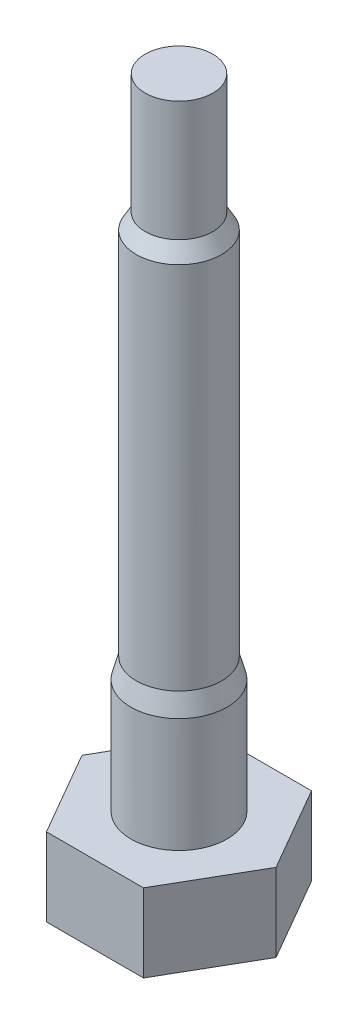
ISO-10303-21;
HEADER;
FILE_DESCRIPTION(('STEP AP214'),'2;1');
FILE_NAME('part.step','',(''),(''),'','','');
FILE_SCHEMA(('AUTOMOTIVE_DESIGN { 1 0 10303 214 1 1 1 1 }'));
ENDSEC;
DATA;
#1=APPLICATION_CONTEXT('core data for automotive mechanical design processes');
#2=APPLICATION_PROTOCOL_DEFINITION('international standard','automotive_design',2000,#1);
#3=PRODUCT_CONTEXT('',#1,'mechanical');
#4=PRODUCT('Part','Part','',(#3));
#5=PRODUCT_RELATED_PRODUCT_CATEGORY('part','',(#4));
#6=PRODUCT_DEFINITION_FORMATION('','',#4);
#7=PRODUCT_DEFINITION_CONTEXT('part definition',#1,'design');
#8=PRODUCT_DEFINITION('design','',#6,#7);
#9=PRODUCT_DEFINITION_SHAPE('','',#8);
#10=(LENGTH_UNIT() NAMED_UNIT(*) SI_UNIT(.MILLI.,.METRE.));
#11=(NAMED_UNIT(*) PLANE_ANGLE_UNIT() SI_UNIT($,.RADIAN.));
#12=(NAMED_UNIT(*) SI_UNIT($,.STERADIAN.) SOLID_ANGLE_UNIT());
#13=UNCERTAINTY_MEASURE_WITH_UNIT(LENGTH_MEASURE(1.E-05),#10,'distance_accuracy_value','');
#14=(GEOMETRIC_REPRESENTATION_CONTEXT(3) GLOBAL_UNCERTAINTY_ASSIGNED_CONTEXT((#13)) GLOBAL_UNIT_ASSIGNED_CONTEXT((#10,
#11,#12)) REPRESENTATION_CONTEXT('',''));
#15=CARTESIAN_POINT('',(0.,0.,0.));
#16=DIRECTION('',(0.,0.,1.));
#17=DIRECTION('',(1.,0.,0.));
#18=AXIS2_PLACEMENT_3D('',#15,#16,#17);
#19=CARTESIAN_POINT('',(3.2042362589755,5.1562,-5.5499));
#20=DIRECTION('',(0.,0.,1.));
#21=DIRECTION('',(1.,0.,0.));
#22=AXIS2_PLACEMENT_3D('',#19,#20,#21);
#23=PLANE('',#22);
#24=DIRECTION('',(-1.,0.,0.));
#25=VECTOR('',#24,1.);
#26=CARTESIAN_POINT('',(3.2042362589755,0.,-5.5499));
#27=LINE('',#26,#25);
#28=CARTESIAN_POINT('',(3.2042362589755,0.,-5.5499));
#29=VERTEX_POINT('',#28);
#30=CARTESIAN_POINT('',(-3.20423625897551,0.,-5.5499));
#31=VERTEX_POINT('',#30);
#32=EDGE_CURVE('E193',#29,#31,#27,.T.);
#33=ORIENTED_EDGE('',*,*,#32,.T.);
#34=DIRECTION('',(0.,-1.,0.));
#35=VECTOR('',#34,1.);
#36=CARTESIAN_POINT('',(-3.20423625897551,5.1562,-5.5499));
#37=LINE('',#36,#35);
#38=CARTESIAN_POINT('',(-3.20423625897551,5.1562,-5.5499));
#39=VERTEX_POINT('',#38);
#40=EDGE_CURVE('E221',#39,#31,#37,.T.);
#41=ORIENTED_EDGE('',*,*,#40,.F.);
#42=DIRECTION('',(-1.,0.,0.));
#43=VECTOR('',#42,1.);
#44=CARTESIAN_POINT('',(3.2042362589755,5.1562,-5.5499));
#45=LINE('',#44,#43);
#46=CARTESIAN_POINT('',(3.2042362589755,5.1562,-5.5499));
#47=VERTEX_POINT('',#46);
#48=EDGE_CURVE('E210',#47,#39,#45,.T.);
#49=ORIENTED_EDGE('',*,*,#48,.F.);
#50=DIRECTION('',(0.,-1.,0.));
#51=VECTOR('',#50,1.);
#52=CARTESIAN_POINT('',(3.2042362589755,5.1562,-5.5499));
#53=LINE('',#52,#51);
#54=EDGE_CURVE('E189',#47,#29,#53,.T.);
#55=ORIENTED_EDGE('',*,*,#54,.T.);
#56=EDGE_LOOP('',(#33,#41,#49,#55));
#57=FACE_BOUND('',#56,.T.);
#58=ADVANCED_FACE('F99',(#57),#23,.F.);
#59=CARTESIAN_POINT('',(-3.20423625897551,5.1562,-5.5499));
#60=DIRECTION('',(0.866025403784438,0.,0.5));
#61=DIRECTION('',(0.5,0.,-0.866025403784439));
#62=AXIS2_PLACEMENT_3D('',#59,#60,#61);
#63=PLANE('',#62);
#64=DIRECTION('',(-0.5,0.,0.866025403784438));
#65=VECTOR('',#64,1.);
#66=CARTESIAN_POINT('',(-3.20423625897551,0.,-5.5499));
#67=LINE('',#66,#65);
#68=CARTESIAN_POINT('',(-6.40847251795101,0.,0.));
#69=VERTEX_POINT('',#68);
#70=EDGE_CURVE('E197',#31,#69,#67,.T.);
#71=ORIENTED_EDGE('',*,*,#70,.T.);
#72=DIRECTION('',(0.,-1.,0.));
#73=VECTOR('',#72,1.);
#74=CARTESIAN_POINT('',(-6.40847251795101,5.1562,0.));
#75=LINE('',#74,#73);
#76=CARTESIAN_POINT('',(-6.40847251795101,5.1562,0.));
#77=VERTEX_POINT('',#76);
#78=EDGE_CURVE('E217',#77,#69,#75,.T.);
#79=ORIENTED_EDGE('',*,*,#78,.F.);
#80=DIRECTION('',(-0.5,0.,0.866025403784438));
#81=VECTOR('',#80,1.);
#82=CARTESIAN_POINT('',(-3.20423625897551,5.1562,-5.5499));
#83=LINE('',#82,#81);
#84=EDGE_CURVE('E157',#39,#77,#83,.T.);
#85=ORIENTED_EDGE('',*,*,#84,.F.);
#86=ORIENTED_EDGE('',*,*,#40,.T.);
#87=EDGE_LOOP('',(#71,#79,#85,#86));
#88=FACE_BOUND('',#87,.T.);
#89=ADVANCED_FACE('F260',(#88),#63,.F.);
#90=CARTESIAN_POINT('',(-6.40847251795101,5.1562,0.));
#91=DIRECTION('',(0.866025403784439,0.,-0.5));
#92=DIRECTION('',(-0.5,0.,-0.866025403784439));
#93=AXIS2_PLACEMENT_3D('',#90,#91,#92);
#94=PLANE('',#93);
#95=DIRECTION('',(0.5,0.,0.866025403784439));
#96=VECTOR('',#95,1.);
#97=CARTESIAN_POINT('',(-6.40847251795101,0.,0.));
#98=LINE('',#97,#96);
#99=CARTESIAN_POINT('',(-3.20423625897551,0.,5.5499));
#100=VERTEX_POINT('',#99);
#101=EDGE_CURVE('E201',#69,#100,#98,.T.);
#102=ORIENTED_EDGE('',*,*,#101,.T.);
#103=DIRECTION('',(0.,-1.,0.));
#104=VECTOR('',#103,1.);
#105=CARTESIAN_POINT('',(-3.20423625897551,5.1562,5.5499));
#106=LINE('',#105,#104);
#107=CARTESIAN_POINT('',(-3.20423625897551,5.1562,5.5499));
#108=VERTEX_POINT('',#107);
#109=EDGE_CURVE('E182',#108,#100,#106,.T.);
#110=ORIENTED_EDGE('',*,*,#109,.F.);
#111=DIRECTION('',(0.5,0.,0.866025403784439));
#112=VECTOR('',#111,1.);
#113=CARTESIAN_POINT('',(-6.40847251795101,5.1562,0.));
#114=LINE('',#113,#112);
#115=EDGE_CURVE('E171',#77,#108,#114,.T.);
#116=ORIENTED_EDGE('',*,*,#115,.F.);
#117=ORIENTED_EDGE('',*,*,#78,.T.);
#118=EDGE_LOOP('',(#102,#110,#116,#117));
#119=FACE_BOUND('',#118,.T.);
#120=ADVANCED_FACE('F257',(#119),#94,.F.);
#121=CARTESIAN_POINT('',(-3.20423625897551,5.1562,5.5499));
#122=DIRECTION('',(0.,0.,-1.));
#123=DIRECTION('',(-1.,0.,0.));
#124=AXIS2_PLACEMENT_3D('',#121,#122,#123);
#125=PLANE('',#124);
#126=DIRECTION('',(1.,0.,0.));
#127=VECTOR('',#126,1.);
#128=CARTESIAN_POINT('',(-3.20423625897551,0.,5.5499));
#129=LINE('',#128,#127);
#130=CARTESIAN_POINT('',(3.2042362589755,0.,5.5499));
#131=VERTEX_POINT('',#130);
#132=EDGE_CURVE('E180',#100,#131,#129,.T.);
#133=ORIENTED_EDGE('',*,*,#132,.T.);
#134=DIRECTION('',(0.,-1.,0.));
#135=VECTOR('',#134,1.);
#136=CARTESIAN_POINT('',(3.2042362589755,5.1562,5.5499));
#137=LINE('',#136,#135);
#138=CARTESIAN_POINT('',(3.2042362589755,5.1562,5.5499));
#139=VERTEX_POINT('',#138);
#140=EDGE_CURVE('E177',#139,#131,#137,.T.);
#141=ORIENTED_EDGE('',*,*,#140,.F.);
#142=DIRECTION('',(1.,0.,0.));
#143=VECTOR('',#142,1.);
#144=CARTESIAN_POINT('',(-3.20423625897551,5.1562,5.5499));
#145=LINE('',#144,#143);
#146=EDGE_CURVE('E165',#108,#139,#145,.T.);
#147=ORIENTED_EDGE('',*,*,#146,.F.);
#148=ORIENTED_EDGE('',*,*,#109,.T.);
#149=EDGE_LOOP('',(#133,#141,#147,#148));
#150=FACE_BOUND('',#149,.T.);
#151=ADVANCED_FACE('F178',(#150),#125,.F.);
#152=CARTESIAN_POINT('',(3.2042362589755,5.1562,5.5499));
#153=DIRECTION('',(-0.866025403784438,0.,-0.5));
#154=DIRECTION('',(-0.5,0.,0.866025403784439));
#155=AXIS2_PLACEMENT_3D('',#152,#153,#154);
#156=PLANE('',#155);
#157=DIRECTION('',(0.5,0.,-0.866025403784438));
#158=VECTOR('',#157,1.);
#159=CARTESIAN_POINT('',(3.2042362589755,0.,5.5499));
#160=LINE('',#159,#158);
#161=CARTESIAN_POINT('',(6.40847251795101,0.,0.));
#162=VERTEX_POINT('',#161);
#163=EDGE_CURVE('E142',#131,#162,#160,.T.);
#164=ORIENTED_EDGE('',*,*,#163,.T.);
#165=DIRECTION('',(0.,-1.,0.));
#166=VECTOR('',#165,1.);
#167=CARTESIAN_POINT('',(6.40847251795101,5.1562,0.));
#168=LINE('',#167,#166);
#169=CARTESIAN_POINT('',(6.40847251795101,5.1562,0.));
#170=VERTEX_POINT('',#169);
#171=EDGE_CURVE('E183',#170,#162,#168,.T.);
#172=ORIENTED_EDGE('',*,*,#171,.F.);
#173=DIRECTION('',(0.5,0.,-0.866025403784438));
#174=VECTOR('',#173,1.);
#175=CARTESIAN_POINT('',(3.2042362589755,5.1562,5.5499));
#176=LINE('',#175,#174);
#177=EDGE_CURVE('E169',#139,#170,#176,.T.);
#178=ORIENTED_EDGE('',*,*,#177,.F.);
#179=ORIENTED_EDGE('',*,*,#140,.T.);
#180=EDGE_LOOP('',(#164,#172,#178,#179));
#181=FACE_BOUND('',#180,.T.);
#182=ADVANCED_FACE('F185',(#181),#156,.F.);
#183=CARTESIAN_POINT('',(6.40847251795101,5.1562,0.));
#184=DIRECTION('',(-0.866025403784439,0.,0.5));
#185=DIRECTION('',(0.5,0.,0.866025403784439));
#186=AXIS2_PLACEMENT_3D('',#183,#184,#185);
#187=PLANE('',#186);
#188=DIRECTION('',(-0.5,0.,-0.866025403784439));
#189=VECTOR('',#188,1.);
#190=CARTESIAN_POINT('',(6.40847251795101,0.,0.));
#191=LINE('',#190,#189);
#192=EDGE_CURVE('E148',#162,#29,#191,.T.);
#193=ORIENTED_EDGE('',*,*,#192,.T.);
#194=ORIENTED_EDGE('',*,*,#54,.F.);
#195=DIRECTION('',(-0.5,0.,-0.866025403784439));
#196=VECTOR('',#195,1.);
#197=CARTESIAN_POINT('',(6.40847251795101,5.1562,0.));
#198=LINE('',#197,#196);
#199=EDGE_CURVE('E118',#170,#47,#198,.T.);
#200=ORIENTED_EDGE('',*,*,#199,.F.);
#201=ORIENTED_EDGE('',*,*,#171,.T.);
#202=EDGE_LOOP('',(#193,#194,#200,#201));
#203=FACE_BOUND('',#202,.T.);
#204=ADVANCED_FACE('F246',(#203),#187,.F.);
#205=CARTESIAN_POINT('',(0.,5.1562,0.));
#206=DIRECTION('',(0.,1.,0.));
#207=DIRECTION('',(0.,0.,1.));
#208=AXIS2_PLACEMENT_3D('',#205,#206,#207);
#209=PLANE('',#208);
#210=CARTESIAN_POINT('',(0.,5.1562,0.));
#211=DIRECTION('',(0.,1.,0.));
#212=DIRECTION('',(0.,0.,1.));
#213=AXIS2_PLACEMENT_3D('',#210,#211,#212);
#214=CIRCLE('',#213,3.175);
#215=CARTESIAN_POINT('',(0.,5.1562,3.175));
#216=VERTEX_POINT('',#215);
#217=EDGE_CURVE('E224',#216,#216,#214,.T.);
#218=ORIENTED_EDGE('',*,*,#217,.F.);
#219=EDGE_LOOP('',(#218));
#220=FACE_BOUND('',#219,.T.);
#221=ORIENTED_EDGE('',*,*,#48,.T.);
#222=ORIENTED_EDGE('',*,*,#84,.T.);
#223=ORIENTED_EDGE('',*,*,#115,.T.);
#224=ORIENTED_EDGE('',*,*,#146,.T.);
#225=ORIENTED_EDGE('',*,*,#177,.T.);
#226=ORIENTED_EDGE('',*,*,#199,.T.);
#227=EDGE_LOOP('',(#221,#222,#223,#224,#225,#226));
#228=FACE_BOUND('',#227,.T.);
#229=ADVANCED_FACE('F167',(#220,#228),#209,.T.);
#230=CARTESIAN_POINT('',(0.,0.,0.));
#231=DIRECTION('',(0.,1.,0.));
#232=DIRECTION('',(0.,0.,1.));
#233=AXIS2_PLACEMENT_3D('',#230,#231,#232);
#234=PLANE('',#233);
#235=CARTESIAN_POINT('',(0.,0.,0.));
#236=DIRECTION('',(0.,-1.,0.));
#237=DIRECTION('',(0.,0.,-1.));
#238=AXIS2_PLACEMENT_3D('',#235,#236,#237);
#239=CIRCLE('',#238,3.175);
#240=CARTESIAN_POINT('',(0.,0.,-3.175));
#241=VERTEX_POINT('',#240);
#242=EDGE_CURVE('E347',#241,#241,#239,.T.);
#243=ORIENTED_EDGE('',*,*,#242,.F.);
#244=EDGE_LOOP('',(#243));
#245=FACE_BOUND('',#244,.T.);
#246=ORIENTED_EDGE('',*,*,#32,.F.);
#247=ORIENTED_EDGE('',*,*,#192,.F.);
#248=ORIENTED_EDGE('',*,*,#163,.F.);
#249=ORIENTED_EDGE('',*,*,#132,.F.);
#250=ORIENTED_EDGE('',*,*,#101,.F.);
#251=ORIENTED_EDGE('',*,*,#70,.F.);
#252=EDGE_LOOP('',(#246,#247,#248,#249,#250,#251));
#253=FACE_BOUND('',#252,.T.);
#254=ADVANCED_FACE('F242',(#245,#253),#234,.F.);
#255=CARTESIAN_POINT('',(0.,12.7,0.));
#256=DIRECTION('',(0.,-1.,0.));
#257=DIRECTION('',(0.,0.,-1.));
#258=AXIS2_PLACEMENT_3D('',#255,#256,#257);
#259=CYLINDRICAL_SURFACE('',#258,3.175);
#260=CARTESIAN_POINT('',(3.175,12.7,0.));
#261=CARTESIAN_POINT('',(3.17500066804615,12.6999987956631,0.0892114796995734));
#262=CARTESIAN_POINT('',(3.17123852700166,12.6998402297505,0.178412327936924));
#263=CARTESIAN_POINT('',(3.15621847252985,12.6995617630556,0.356179029617902));
#264=CARTESIAN_POINT('',(3.14496123124316,12.6994418588077,0.44474493928134));
#265=CARTESIAN_POINT('',(3.11501301175547,12.699403615837,0.620723265292362));
#266=CARTESIAN_POINT('',(3.09631252472967,12.6994855356441,0.708134057809241));
#267=CARTESIAN_POINT('',(3.05160739606798,12.6998007378407,0.881073495619962));
#268=CARTESIAN_POINT('',(3.02560323264688,12.7000340103217,0.966602263745808));
#269=CARTESIAN_POINT('',(2.98127501149104,12.700308948663,1.09298612397601));
#270=CARTESIAN_POINT('',(2.96561349890542,12.7003880961716,1.13479239008732));
#271=CARTESIAN_POINT('',(2.93254265917055,12.7004562555244,1.21770711787269));
#272=CARTESIAN_POINT('',(2.9151333612047,12.7004452688735,1.25881559118466));
#273=CARTESIAN_POINT('',(2.86032778148626,12.7003208220235,1.38098295230681));
#274=CARTESIAN_POINT('',(2.82034795175892,12.7001159067612,1.46090048836334));
#275=CARTESIAN_POINT('',(2.73381264852016,12.6998049651829,1.61705338160941));
#276=CARTESIAN_POINT('',(2.68725885344378,12.699698913678,1.69328967203133));
#277=CARTESIAN_POINT('',(2.58789644821255,12.6996862712116,1.84157051521897));
#278=CARTESIAN_POINT('',(2.53508786353219,12.6997796794378,1.91361508505493));
#279=CARTESIAN_POINT('',(2.42357901753758,12.7000714716982,2.05301103324262));
#280=CARTESIAN_POINT('',(2.36487843388698,12.7002698614781,2.12036215448577));
#281=CARTESIAN_POINT('',(2.27274600711182,12.7003906485019,2.21748597694256));
#282=CARTESIAN_POINT('',(2.24135131261152,12.7004014361458,2.24921333772721));
#283=CARTESIAN_POINT('',(2.17725256977265,12.7003424908888,2.31131730361052));
#284=CARTESIAN_POINT('',(2.14454850551439,12.7002727570087,2.34169389227662));
#285=CARTESIAN_POINT('',(2.04455836195408,12.7000377693808,2.43071332651415));
#286=CARTESIAN_POINT('',(1.97538264740241,12.6998467129905,2.48725815489638));
#287=CARTESIAN_POINT('',(1.83252261868998,12.6996276053121,2.59431222092848));
#288=CARTESIAN_POINT('',(1.75883830881364,12.699599553869,2.64482146431372));
#289=CARTESIAN_POINT('',(1.60749023500245,12.6997375098977,2.73944562934866));
#290=CARTESIAN_POINT('',(1.52982729130956,12.6999034775227,2.78356186186918));
#291=CARTESIAN_POINT('',(1.37102642004151,12.7002410067086,2.86511477494592));
#292=CARTESIAN_POINT('',(1.28988693796305,12.7004125707634,2.90254842796812));
#293=CARTESIAN_POINT('',(1.12474264504461,12.7003998366292,2.97044603626087));
#294=CARTESIAN_POINT('',(1.04073783913484,12.7002155390524,3.00091000352307));
#295=CARTESIAN_POINT('',(0.870497897151222,12.6998784801836,3.05463934912132));
#296=CARTESIAN_POINT('',(0.784263785914742,12.6997257046806,3.07790797364498));
#297=CARTESIAN_POINT('',(0.61012256412016,12.6996164347249,3.1171050778318));
#298=CARTESIAN_POINT('',(0.52221502571364,12.6996599911585,3.13303165336342));
#299=CARTESIAN_POINT('',(0.345359317470969,12.6999003780277,3.15742260360753));
#300=CARTESIAN_POINT('',(0.256411146868026,12.7000972085763,3.16588697282115));
#301=CARTESIAN_POINT('',(0.122713654247171,12.700320648543,3.17294189823177));
#302=CARTESIAN_POINT('',(0.078096883373178,12.7003831639005,3.17435310889001));
#303=CARTESIAN_POINT('',(-0.0111560236969769,12.7004204116712,3.17529404046456));
#304=CARTESIAN_POINT('',(-0.0557921596543766,12.7003951451376,3.17482378395428));
#305=CARTESIAN_POINT('',(-0.189608037780999,12.7002406218208,3.17058920259825));
#306=CARTESIAN_POINT('',(-0.278714565411064,12.7000326644206,3.16400208279061));
#307=CARTESIAN_POINT('',(-0.456042980689964,12.6997315995904,3.14334532704295));
#308=CARTESIAN_POINT('',(-0.544264891788434,12.699638489108,3.12927588998315));
#309=CARTESIAN_POINT('',(-0.719210184345248,12.699655567766,3.09375638793322));
#310=CARTESIAN_POINT('',(-0.805933565677795,12.6997657569236,3.07230632232352));
#311=CARTESIAN_POINT('',(-0.977274822520131,12.7000831301495,3.02217214956026));
#312=CARTESIAN_POINT('',(-1.06189269534916,12.7002903143414,2.99348803319671));
#313=CARTESIAN_POINT('',(-1.18676131149117,12.7004075310723,2.94520225145276));
#314=CARTESIAN_POINT('',(-1.22804543864869,12.7004143338025,2.92822830166503));
#315=CARTESIAN_POINT('',(-1.30986238745832,12.7003490513639,2.89255548285971));
#316=CARTESIAN_POINT('',(-1.35039519558065,12.700276964776,2.87385658281534));
#317=CARTESIAN_POINT('',(-1.47074941762506,12.7000369331207,2.81522328321624));
#318=CARTESIAN_POINT('',(-1.54934897935035,12.6998451903213,2.77274363845178));
#319=CARTESIAN_POINT('',(-1.70268022773141,12.6996264594089,2.68131962083326));
#320=CARTESIAN_POINT('',(-1.77741191754741,12.6995994711611,2.6323752532613));
#321=CARTESIAN_POINT('',(-1.92248939008046,12.6997395138185,2.52836406526786));
#322=CARTESIAN_POINT('',(-1.99283517118801,12.6999065447948,2.47329724259964));
#323=CARTESIAN_POINT('',(-2.12863738230503,12.7002371340459,2.35743396404006));
#324=CARTESIAN_POINT('',(-2.19409381824127,12.700400692325,2.29663751509423));
#325=CARTESIAN_POINT('',(-2.31965507463998,12.7003816872097,2.16974479411574));
#326=CARTESIAN_POINT('',(-2.37975970642491,12.7001991116175,2.10364833538756));
#327=CARTESIAN_POINT('',(-2.49418769200483,12.6998802407988,1.96662644125098));
#328=CARTESIAN_POINT('',(-2.54851104428616,12.6997439455845,1.89570100457826));
#329=CARTESIAN_POINT('',(-2.65098888540422,12.6996662828093,1.74952882098145));
#330=CARTESIAN_POINT('',(-2.69914337368839,12.699724915266,1.67428207367029));
#331=CARTESIAN_POINT('',(-2.78894670219131,12.6999822864131,1.51998894160511));
#332=CARTESIAN_POINT('',(-2.83059553960176,12.700181025164,1.44094255521093));
#333=CARTESIAN_POINT('',(-2.8879561327685,12.7003862979077,1.31997281639428));
#334=CARTESIAN_POINT('',(-2.90622610052374,12.7004392503713,1.27924452536006));
#335=CARTESIAN_POINT('',(-2.94103346077828,12.7004502682379,1.19705424957848));
#336=CARTESIAN_POINT('',(-2.95757085577841,12.7004083337779,1.15559226589026));
#337=CARTESIAN_POINT('',(-3.00453601378475,12.7002029939981,1.0302185086585));
#338=CARTESIAN_POINT('',(-3.03232522085151,12.6999600688965,0.945301058491968));
#339=CARTESIAN_POINT('',(-3.08064759187292,12.6995862842079,0.773437837003221));
#340=CARTESIAN_POINT('',(-3.10118076138941,12.6994554245351,0.686492067235789));
#341=CARTESIAN_POINT('',(-3.13485075998447,12.6993966763062,0.511176862156631));
#342=CARTESIAN_POINT('',(-3.14798759065112,12.6994687877066,0.422807427150586));
#343=CARTESIAN_POINT('',(-3.16676940650138,12.6997315421912,0.245282437228455));
#344=CARTESIAN_POINT('',(-3.17241485247487,12.699922177984,0.156126931002669));
#345=CARTESIAN_POINT('',(-3.17617569190627,12.7000220441576,-0.0223431509904027));
#346=CARTESIAN_POINT('',(-3.17429108666699,12.6999312745869,-0.111657726730164));
#347=CARTESIAN_POINT('',(-3.16300512629471,12.6996798721559,-0.289810465261936));
#348=CARTESIAN_POINT('',(-3.15360376861942,12.6995192392719,-0.378648627892805));
#349=CARTESIAN_POINT('',(-3.12735110202942,12.6993877955324,-0.555217482892212));
#350=CARTESIAN_POINT('',(-3.11049979877964,12.6994169845326,-0.642948176102815));
#351=CARTESIAN_POINT('',(-3.06946620645862,12.6996605667185,-0.816681973669178));
#352=CARTESIAN_POINT('',(-3.04528357373062,12.6998749685868,-0.902684996838699));
#353=CARTESIAN_POINT('',(-2.98975934524163,12.7002695047297,-1.07234841203395));
#354=CARTESIAN_POINT('',(-2.9584177566607,12.7004496390385,-1.15600880640913));
#355=CARTESIAN_POINT('',(-2.88879865737803,12.7004398599594,-1.32039184925953));
#356=CARTESIAN_POINT('',(-2.85052114557494,12.7002499465126,-1.40111449726828));
#357=CARTESIAN_POINT('',(-2.767301563389,12.6999127505427,-1.55904901352777));
#358=CARTESIAN_POINT('',(-2.72235948825634,12.69976546805,-1.63626087927634));
#359=CARTESIAN_POINT('',(-2.62613207981478,12.6996634851959,-1.78662356900934));
#360=CARTESIAN_POINT('',(-2.57484663492103,12.6997087882227,-1.85977432152281));
#361=CARTESIAN_POINT('',(-2.4662875579303,12.6999442881239,-2.0015034526942));
#362=CARTESIAN_POINT('',(-2.40901392254421,12.700134485078,-2.07008182884066));
#363=CARTESIAN_POINT('',(-2.31893991267812,12.700332841732,-2.16913267281095));
#364=CARTESIAN_POINT('',(-2.28821766277958,12.7003844717273,-2.20151689506254));
#365=CARTESIAN_POINT('',(-2.22543574252222,12.7003979334104,-2.26496191232114));
#366=CARTESIAN_POINT('',(-2.19337607241292,12.7003597651149,-2.29602270757507));
#367=CARTESIAN_POINT('',(-2.09527696897043,12.700180315773,-2.38713244262961));
#368=CARTESIAN_POINT('',(-2.02730407376672,12.6999741021609,-2.44512342926776));
#369=CARTESIAN_POINT('',(-1.88672396622237,12.6996898870444,-2.55516501262463));
#370=CARTESIAN_POINT('',(-1.81411680375507,12.6996118841604,-2.60721567325554));
#371=CARTESIAN_POINT('',(-1.66477352376217,12.6996559261225,-2.70501757549271));
#372=CARTESIAN_POINT('',(-1.58803740520034,12.6997779710188,-2.75076881551805));
#373=CARTESIAN_POINT('',(-1.43098465257938,12.7001149381488,-2.83564379139157));
#374=CARTESIAN_POINT('',(-1.35066802151867,12.7003298603048,-2.87476753278967));
#375=CARTESIAN_POINT('',(-1.18702410699898,12.7004337130804,-2.94611029283593));
#376=CARTESIAN_POINT('',(-1.10369682489137,12.7003226438465,-2.9783293145833));
#377=CARTESIAN_POINT('',(-0.934628258706036,12.7000201172787,-3.0356320133256));
#378=CARTESIAN_POINT('',(-0.848887078035371,12.6998286633835,-3.06071599546313));
#379=CARTESIAN_POINT('',(-0.675596204290306,12.6996281784152,-3.10357234317822));
#380=CARTESIAN_POINT('',(-0.588046512623295,12.6996191472002,-3.12134471444546));
#381=CARTESIAN_POINT('',(-0.411761344808559,12.6997882435463,-3.14945142705188));
#382=CARTESIAN_POINT('',(-0.323025866100786,12.6999663715115,-3.15978575233008));
#383=CARTESIAN_POINT('',(-0.144999555679939,12.7002877968917,-3.17294290162053));
#384=CARTESIAN_POINT('',(-0.0557087242877251,12.7004310943269,-3.17576572997222));
#385=CARTESIAN_POINT('',(0.122795461960807,12.700372411586,-3.17387987979561));
#386=CARTESIAN_POINT('',(0.212008814631801,12.7001704219684,-3.16917099531956));
#387=CARTESIAN_POINT('',(0.389722573344511,12.6998318565978,-3.1522544243721));
#388=CARTESIAN_POINT('',(0.478222979263582,12.6996952808561,-3.14004673661073));
#389=CARTESIAN_POINT('',(0.653878312572644,12.6996209306763,-3.10822075646505));
#390=CARTESIAN_POINT('',(0.741033237316302,12.6996831566293,-3.08860244950724));
#391=CARTESIAN_POINT('',(0.913391164955352,12.6999474516496,-3.0420891833483));
#392=CARTESIAN_POINT('',(0.998594166678588,12.7001495208009,-3.01519421977757));
#393=CARTESIAN_POINT('',(1.12445344780675,12.7003515466,-2.96954935447788));
#394=CARTESIAN_POINT('',(1.16608761541816,12.7004020422026,-2.95344822863927));
#395=CARTESIAN_POINT('',(1.24864044420654,12.7004103775218,-2.91950574683688));
#396=CARTESIAN_POINT('',(1.28955910544703,12.7003682172465,-2.9016643910276));
#397=CARTESIAN_POINT('',(1.41112820059234,12.7001802463516,-2.84557626877307));
#398=CARTESIAN_POINT('',(1.49061040195797,12.6999729542396,-2.80475867905565));
#399=CARTESIAN_POINT('',(1.64584041657692,12.6996884754526,-2.71657958831338));
#400=CARTESIAN_POINT('',(1.72158837685078,12.6996112836514,-2.66921834519786));
#401=CARTESIAN_POINT('',(1.86882806736398,12.6996572009181,-2.56828198961017));
#402=CARTESIAN_POINT('',(1.94031980097683,12.6997803098271,-2.51470688206322));
#403=CARTESIAN_POINT('',(2.07852474483769,12.700113996874,-2.40173375284949));
#404=CARTESIAN_POINT('',(2.1452386784925,12.7003245617371,-2.34233661593586));
#405=CARTESIAN_POINT('',(2.2734272749259,12.7004194282541,-2.21813388524052));
#406=CARTESIAN_POINT('',(2.33490191935161,12.700303728765,-2.15332827251483));
#407=CARTESIAN_POINT('',(2.45218916282303,12.7000118005129,-2.01875261974013));
#408=CARTESIAN_POINT('',(2.50800031786194,12.6998355563629,-1.94898132127812));
#409=CARTESIAN_POINT('',(2.61354544929997,12.6996662452248,-1.80498577432477));
#410=CARTESIAN_POINT('',(2.66327952444066,12.69967317526,-1.73076159821388));
#411=CARTESIAN_POINT('',(2.75633966835455,12.6998659577136,-1.57835124465533));
#412=CARTESIAN_POINT('',(2.79966268955624,12.700051894912,-1.50016320649682));
#413=CARTESIAN_POINT('',(2.87956709444057,12.7003590968849,-1.34040875362401));
#414=CARTESIAN_POINT('',(2.91614803885662,12.7004803574464,-1.25884211920772));
#415=CARTESIAN_POINT('',(2.98226783516299,12.7003633912027,-1.09300613023484));
#416=CARTESIAN_POINT('',(3.01181442011465,12.7001255612876,-1.00873986021151));
#417=CARTESIAN_POINT('',(3.06370032830251,12.6997127274992,-0.838046684381591));
#418=CARTESIAN_POINT('',(3.08604153298594,12.6995377072238,-0.751620348966125));
#419=CARTESIAN_POINT('',(3.12804771295575,12.6993741480141,-0.555319666313466));
#420=CARTESIAN_POINT('',(3.1456398661206,12.6994433153123,-0.444995597013636));
#421=CARTESIAN_POINT('',(3.16911559227657,12.6997569942259,-0.223108811475924));
#422=CARTESIAN_POINT('',(3.17499916470459,12.7000015058496,-0.111546095178472));
#423=CARTESIAN_POINT('',(3.175,12.7,0.));
#424=B_SPLINE_CURVE_WITH_KNOTS('',3,(#260,#261,#262,#263,#264,#265,#266,#267,#268,#269,#270,
#271,#272,#273,#274,#275,#276,#277,#278,#279,#280,#281,#282,#283,#284,#285,#286,#287,#288,#289,
#290,#291,#292,#293,#294,#295,#296,#297,#298,#299,#300,#301,#302,#303,#304,#305,#306,#307,#308,
#309,#310,#311,#312,#313,#314,#315,#316,#317,#318,#319,#320,#321,#322,#323,#324,#325,#326,#327,
#328,#329,#330,#331,#332,#333,#334,#335,#336,#337,#338,#339,#340,#341,#342,#343,#344,#345,#346,
#347,#348,#349,#350,#351,#352,#353,#354,#355,#356,#357,#358,#359,#360,#361,#362,#363,#364,#365,
#366,#367,#368,#369,#370,#371,#372,#373,#374,#375,#376,#377,#378,#379,#380,#381,#382,#383,#384,
#385,#386,#387,#388,#389,#390,#391,#392,#393,#394,#395,#396,#397,#398,#399,#400,#401,#402,#403,
#404,#405,#406,#407,#408,#409,#410,#411,#412,#413,#414,#415,#416,#417,#418,#419,#420,#421,#422,
#423),.UNSPECIFIED.,.T.,.F.,(4,2,2,2,2,2,2,2,2,2,2,2,2,2,2,2,2,2,2,2,2,2,2,2,2,2,2,2,2,2,2,2,2,
2,2,2,2,2,2,2,2,2,2,2,2,2,2,2,2,2,2,2,2,2,2,2,2,2,2,2,2,2,2,2,2,2,2,2,2,2,2,2,2,2,2,2,2,2,2,2,2,
4),(0.,0.267537388039238,0.535050787268836,0.802907040253556,1.07074575919537,1.20464236108109,
1.33853672761823,1.60627251473767,1.87394006794776,2.14160653104036,2.40928764547795,
2.54315724899264,2.67702848062607,2.94472018033721,3.21241162567071,3.48004810364286,
3.7478055279478,4.01556249156063,4.2831984794582,4.55090383870272,4.81860939521878,
4.95249249409004,5.08637398666735,5.35407913276135,5.62177716359993,5.88947521691077,
6.15717361104139,6.29105132829479,6.42493145408508,6.69262004442505,6.96030841604741,
7.22799688590281,7.49568503126606,7.76338261022536,8.03108025927346,8.29877793229955,
8.56647572088224,8.70035666582875,8.83423741752482,9.10193978214422,9.36964194156644,
9.63734404350997,9.90502967851918,10.1727152672149,10.4404009464464,10.7080864221305,
10.9757844475369,11.2434822044575,11.511180003886,11.7788779941026,12.0465806940066,
12.314283540951,12.4481647911012,12.5820460162738,12.8497490540169,13.1174492112621,
13.3851494356903,13.6528494359433,13.9205493160376,14.1882377457504,14.4559259671551,
14.7236147665772,14.9913034113533,15.2589993759538,15.526695386604,15.7943919236996,
16.0620886215466,16.1959717288892,16.3298548243438,16.5975616690526,16.8652579654629,
17.1329540496931,17.4006095159836,17.6682659198154,17.9359903968133,18.2037105231938,
18.4715575075422,18.7394219367635,19.0069905214211,19.2744891827017,19.6090061037898,
19.9435230409656),.UNSPECIFIED.);
#425=CARTESIAN_POINT('',(-3.175,12.7,0.));
#426=VERTEX_POINT('',#425);
#427=EDGE_CURVE('E198',#426,#426,#424,.F.);
#428=ORIENTED_EDGE('',*,*,#427,.F.);
#429=EDGE_LOOP('',(#428));
#430=FACE_BOUND('',#429,.T.);
#431=ORIENTED_EDGE('',*,*,#217,.T.);
#432=EDGE_LOOP('',(#431));
#433=FACE_BOUND('',#432,.T.);
#434=ADVANCED_FACE('F238',(#430,#433),#259,.T.);
#435=CARTESIAN_POINT('',(-3.178556,12.6867288273283,0.));
#436=CARTESIAN_POINT('',(-3.17737066666667,12.6911525515522,0.));
#437=CARTESIAN_POINT('',(-3.17618533333333,12.6955762757761,0.));
#438=CARTESIAN_POINT('',(-3.175,12.7,0.));
#439=CARTESIAN_POINT('',(-3.05646666666667,13.1423724223905,0.));
#440=CARTESIAN_POINT('',(-2.93793333333334,13.584744844781,0.));
#441=CARTESIAN_POINT('',(-2.8194,14.0271172671715,0.));
#442=CARTESIAN_POINT('',(-3.178556,12.6867288273283,0.416072004122435));
#443=CARTESIAN_POINT('',(-3.17737066666667,12.6911525515522,0.415916844353171));
#444=CARTESIAN_POINT('',(-3.17618533333333,12.6955762757761,0.415761684583907));
#445=CARTESIAN_POINT('',(-3.175,12.7,0.415606524814643));
#446=CARTESIAN_POINT('',(-3.05646666666667,13.1423724223905,0.40009054788823));
#447=CARTESIAN_POINT('',(-2.93793333333334,13.584744844781,0.384574570961817));
#448=CARTESIAN_POINT('',(-2.8194,14.0271172671715,0.369058594035403));
#449=CARTESIAN_POINT('',(-3.01321963154757,12.6867288273283,1.24810575079722));
#450=CARTESIAN_POINT('',(-3.01209604790897,12.6911525515522,1.247640313375));
#451=CARTESIAN_POINT('',(-3.01097246427038,12.6955762757761,1.24717487595278));
#452=CARTESIAN_POINT('',(-3.00984888063178,12.7,1.24670943853056));
#453=CARTESIAN_POINT('',(-2.8974905167722,13.1423724223905,1.20016569630867));
#454=CARTESIAN_POINT('',(-2.78513215291263,13.584744844781,1.15362195408678));
#455=CARTESIAN_POINT('',(-2.67277378905305,14.0271172671715,1.10707821186489));
#456=CARTESIAN_POINT('',(-2.3061328329366,12.6867288273283,2.30618003036527));
#457=CARTESIAN_POINT('',(-2.30527277942789,12.6911525515522,2.30532005673191));
#458=CARTESIAN_POINT('',(-2.30441272591919,12.6955762757761,2.30446008309855));
#459=CARTESIAN_POINT('',(-2.30355267241048,12.7,2.30360010946518));
#460=CARTESIAN_POINT('',(-2.21754732153994,13.1423724223905,2.21760274612891));
#461=CARTESIAN_POINT('',(-2.1315419706694,13.584744844781,2.13160538279264));
#462=CARTESIAN_POINT('',(-2.04553661979887,14.0271172671715,2.04560801945637));
#463=CARTESIAN_POINT('',(-1.24810576015478,12.6867288273283,3.01315256380509));
#464=CARTESIAN_POINT('',(-1.24764032389349,12.6911525515522,3.01202890357291));
#465=CARTESIAN_POINT('',(-1.24717488763219,12.6955762757761,3.01090524334074));
#466=CARTESIAN_POINT('',(-1.2467094513709,12.7,3.00978158310857));
#467=CARTESIAN_POINT('',(-1.20016582524169,13.1423724223905,2.89741555989141));
#468=CARTESIAN_POINT('',(-1.15362219911247,13.584744844781,2.78504953667426));
#469=CARTESIAN_POINT('',(-1.10707857298326,14.0271172671715,2.6726835134571));
#470=CARTESIAN_POINT('',(0.,12.6867288273283,3.26142269737321));
#471=CARTESIAN_POINT('',(0.,12.6911525515522,3.26020646997926));
#472=CARTESIAN_POINT('',(0.,12.6955762757761,3.25899024258532));
#473=CARTESIAN_POINT('',(0.,12.7,3.25777401519137));
#474=CARTESIAN_POINT('',(0.,13.1423724223905,3.13615127579686));
#475=CARTESIAN_POINT('',(0.,13.584744844781,3.01452853640235));
#476=CARTESIAN_POINT('',(0.,14.0271172671715,2.89290579700783));
#477=CARTESIAN_POINT('',(1.24810576015479,12.6867288273283,3.01315256380509));
#478=CARTESIAN_POINT('',(1.2476403238935,12.6911525515522,3.01202890357291));
#479=CARTESIAN_POINT('',(1.2471748876322,12.6955762757761,3.01090524334074));
#480=CARTESIAN_POINT('',(1.24670945137091,12.7,3.00978158310857));
#481=CARTESIAN_POINT('',(1.20016582524169,13.1423724223905,2.89741555989141));
#482=CARTESIAN_POINT('',(1.15362219911247,13.584744844781,2.78504953667425));
#483=CARTESIAN_POINT('',(1.10707857298325,14.0271172671715,2.67268351345709));
#484=CARTESIAN_POINT('',(2.30613283293659,12.6867288273283,2.30618003036527));
#485=CARTESIAN_POINT('',(2.30527277942788,12.6911525515522,2.3053200567319));
#486=CARTESIAN_POINT('',(2.30441272591918,12.6955762757761,2.30446008309854));
#487=CARTESIAN_POINT('',(2.30355267241047,12.7,2.30360010946518));
#488=CARTESIAN_POINT('',(2.21754732153994,13.1423724223905,2.21760274612891));
#489=CARTESIAN_POINT('',(2.13154197066941,13.584744844781,2.13160538279264));
#490=CARTESIAN_POINT('',(2.04553661979887,14.0271172671715,2.04560801945637));
#491=CARTESIAN_POINT('',(3.01321963154758,12.6867288273283,1.24810575079722));
#492=CARTESIAN_POINT('',(3.01209604790899,12.6911525515522,1.247640313375));
#493=CARTESIAN_POINT('',(3.01097246427039,12.6955762757761,1.24717487595278));
#494=CARTESIAN_POINT('',(3.0098488806318,12.7,1.24670943853056));
#495=CARTESIAN_POINT('',(2.89749051677221,13.1423724223905,1.20016569630867));
#496=CARTESIAN_POINT('',(2.78513215291263,13.584744844781,1.15362195408677));
#497=CARTESIAN_POINT('',(2.67277378905305,14.0271172671715,1.10707821186488));
#498=CARTESIAN_POINT('',(3.178556,12.6867288273283,0.416072004122436));
#499=CARTESIAN_POINT('',(3.17737066666667,12.6911525515522,0.415916844353172));
#500=CARTESIAN_POINT('',(3.17618533333333,12.6955762757761,0.415761684583908));
#501=CARTESIAN_POINT('',(3.175,12.7,0.415606524814644));
#502=CARTESIAN_POINT('',(3.05646666666667,13.1423724223905,0.400090547888231));
#503=CARTESIAN_POINT('',(2.93793333333334,13.584744844781,0.384574570961817));
#504=CARTESIAN_POINT('',(2.8194,14.0271172671715,0.369058594035404));
#505=CARTESIAN_POINT('',(3.178556,12.6867288273283,-0.416072004122436));
#506=CARTESIAN_POINT('',(3.17737066666667,12.6911525515522,-0.415916844353172));
#507=CARTESIAN_POINT('',(3.17618533333333,12.6955762757761,-0.415761684583907));
#508=CARTESIAN_POINT('',(3.175,12.7,-0.415606524814643));
#509=CARTESIAN_POINT('',(3.05646666666667,13.1423724223905,-0.40009054788823));
#510=CARTESIAN_POINT('',(2.93793333333334,13.584744844781,-0.384574570961817));
#511=CARTESIAN_POINT('',(2.8194,14.0271172671715,-0.369058594035404));
#512=CARTESIAN_POINT('',(3.01321963154757,12.6867288273283,-1.24810575079722));
#513=CARTESIAN_POINT('',(3.01209604790897,12.6911525515522,-1.247640313375));
#514=CARTESIAN_POINT('',(3.01097246427038,12.6955762757761,-1.24717487595278));
#515=CARTESIAN_POINT('',(3.00984888063178,12.7,-1.24670943853056));
#516=CARTESIAN_POINT('',(2.8974905167722,13.1423724223905,-1.20016569630867));
#517=CARTESIAN_POINT('',(2.78513215291262,13.584744844781,-1.15362195408678));
#518=CARTESIAN_POINT('',(2.67277378905304,14.0271172671715,-1.10707821186489));
#519=CARTESIAN_POINT('',(2.3061328329366,12.6867288273283,-2.30618003036527));
#520=CARTESIAN_POINT('',(2.30527277942789,12.6911525515522,-2.30532005673191));
#521=CARTESIAN_POINT('',(2.30441272591919,12.6955762757761,-2.30446008309854));
#522=CARTESIAN_POINT('',(2.30355267241048,12.7,-2.30360010946518));
#523=CARTESIAN_POINT('',(2.21754732153995,13.1423724223905,-2.21760274612891));
#524=CARTESIAN_POINT('',(2.13154197066941,13.584744844781,-2.13160538279264));
#525=CARTESIAN_POINT('',(2.04553661979887,14.0271172671715,-2.04560801945637));
#526=CARTESIAN_POINT('',(1.24810576015477,12.6867288273283,-3.01315256380509));
#527=CARTESIAN_POINT('',(1.24764032389348,12.6911525515522,-3.01202890357292));
#528=CARTESIAN_POINT('',(1.24717488763219,12.6955762757761,-3.01090524334075));
#529=CARTESIAN_POINT('',(1.2467094513709,12.7,-3.00978158310858));
#530=CARTESIAN_POINT('',(1.20016582524168,13.1423724223905,-2.89741555989142));
#531=CARTESIAN_POINT('',(1.15362219911247,13.584744844781,-2.78504953667426));
#532=CARTESIAN_POINT('',(1.10707857298325,14.0271172671715,-2.67268351345711));
#533=CARTESIAN_POINT('',(0.,12.6867288273283,-3.2614226973732));
#534=CARTESIAN_POINT('',(0.,12.6911525515522,-3.26020646997926));
#535=CARTESIAN_POINT('',(0.,12.6955762757761,-3.25899024258531));
#536=CARTESIAN_POINT('',(0.,12.7,-3.25777401519137));
#537=CARTESIAN_POINT('',(0.,13.1423724223905,-3.13615127579685));
#538=CARTESIAN_POINT('',(0.,13.584744844781,-3.01452853640234));
#539=CARTESIAN_POINT('',(0.,14.0271172671715,-2.89290579700782));
#540=CARTESIAN_POINT('',(-1.24810576015479,12.6867288273283,-3.01315256380509));
#541=CARTESIAN_POINT('',(-1.2476403238935,12.6911525515522,-3.01202890357292));
#542=CARTESIAN_POINT('',(-1.24717488763221,12.6955762757761,-3.01090524334075));
#543=CARTESIAN_POINT('',(-1.24670945137092,12.7,-3.00978158310858));
#544=CARTESIAN_POINT('',(-1.2001658252417,13.1423724223905,-2.89741555989142));
#545=CARTESIAN_POINT('',(-1.15362219911248,13.584744844781,-2.78504953667426));
#546=CARTESIAN_POINT('',(-1.10707857298326,14.0271172671715,-2.6726835134571));
#547=CARTESIAN_POINT('',(-2.30613283293659,12.6867288273283,-2.30618003036526));
#548=CARTESIAN_POINT('',(-2.30527277942788,12.6911525515522,-2.3053200567319));
#549=CARTESIAN_POINT('',(-2.30441272591918,12.6955762757761,-2.30446008309854));
#550=CARTESIAN_POINT('',(-2.30355267241047,12.7,-2.30360010946517));
#551=CARTESIAN_POINT('',(-2.21754732153994,13.1423724223905,-2.21760274612891));
#552=CARTESIAN_POINT('',(-2.1315419706694,13.584744844781,-2.13160538279264));
#553=CARTESIAN_POINT('',(-2.04553661979887,14.0271172671715,-2.04560801945637));
#554=CARTESIAN_POINT('',(-3.01321963154758,12.6867288273283,-1.24810575079722));
#555=CARTESIAN_POINT('',(-3.01209604790898,12.6911525515522,-1.247640313375));
#556=CARTESIAN_POINT('',(-3.01097246427039,12.6955762757761,-1.24717487595279));
#557=CARTESIAN_POINT('',(-3.00984888063179,12.7,-1.24670943853057));
#558=CARTESIAN_POINT('',(-2.89749051677221,13.1423724223905,-1.20016569630867));
#559=CARTESIAN_POINT('',(-2.78513215291263,13.584744844781,-1.15362195408678));
#560=CARTESIAN_POINT('',(-2.67277378905305,14.0271172671715,-1.10707821186489));
#561=CARTESIAN_POINT('',(-3.178556,12.6867288273283,-0.416072004122436));
#562=CARTESIAN_POINT('',(-3.17737066666667,12.6911525515522,-0.415916844353172));
#563=CARTESIAN_POINT('',(-3.17618533333333,12.6955762757761,-0.415761684583908));
#564=CARTESIAN_POINT('',(-3.175,12.7,-0.415606524814644));
#565=CARTESIAN_POINT('',(-3.05646666666667,13.1423724223905,-0.400090547888231));
#566=CARTESIAN_POINT('',(-2.93793333333334,13.584744844781,-0.384574570961818));
#567=CARTESIAN_POINT('',(-2.8194,14.0271172671715,-0.369058594035404));
#568=CARTESIAN_POINT('',(-3.178556,12.6867288273283,0.));
#569=CARTESIAN_POINT('',(-3.17737066666667,12.6911525515522,0.));
#570=CARTESIAN_POINT('',(-3.17618533333333,12.6955762757761,0.));
#571=CARTESIAN_POINT('',(-3.175,12.7,0.));
#572=CARTESIAN_POINT('',(-3.05646666666667,13.1423724223905,0.));
#573=CARTESIAN_POINT('',(-2.93793333333334,13.584744844781,0.));
#574=CARTESIAN_POINT('',(-2.8194,14.0271172671715,0.));
#575=B_SPLINE_SURFACE_WITH_KNOTS('',3,3,((#435,#436,#437,#438,#439,#440,#441),(#442,#443,#444,
#445,#446,#447,#448),(#449,#450,#451,#452,#453,#454,#455),(#456,#457,#458,#459,#460,#461,#462),
(#463,#464,#465,#466,#467,#468,#469),(#470,#471,#472,#473,#474,#475,#476),(#477,#478,#479,#480,
#481,#482,#483),(#484,#485,#486,#487,#488,#489,#490),(#491,#492,#493,#494,#495,#496,#497),(#498,
#499,#500,#501,#502,#503,#504),(#505,#506,#507,#508,#509,#510,#511),(#512,#513,#514,#515,#516,
#517,#518),(#519,#520,#521,#522,#523,#524,#525),(#526,#527,#528,#529,#530,#531,#532),(#533,#534,
#535,#536,#537,#538,#539),(#540,#541,#542,#543,#544,#545,#546),(#547,#548,#549,#550,#551,#552,
#553),(#554,#555,#556,#557,#558,#559,#560),(#561,#562,#563,#564,#565,#566,#567),(#568,#569,#570,
#571,#572,#573,#574)),.UNSPECIFIED.,.T.,.F.,.F.,(4,1,1,1,1,1,1,1,2,1,1,1,1,1,1,1,4),(4,3,4),(0.,
0.0625,0.125,0.1875,0.25,0.3125,0.375,0.4375,0.5,0.5625,0.625,0.6875,0.75,0.8125,0.875,0.9375,
1.),(-0.01,0.,1.),.UNSPECIFIED.);
#576=CARTESIAN_POINT('',(0.,14.0271172671715,0.));
#577=DIRECTION('',(0.,1.,0.));
#578=DIRECTION('',(0.,0.,1.));
#579=AXIS2_PLACEMENT_3D('',#576,#577,#578);
#580=CIRCLE('',#579,2.8194);
#581=CARTESIAN_POINT('',(-2.8194,14.0271172671715,0.));
#582=VERTEX_POINT('',#581);
#583=EDGE_CURVE('E232',#582,#582,#580,.T.);
#584=CARTESIAN_POINT('',(-3.175,12.7,0.));
#585=CARTESIAN_POINT('',(-3.17129583333333,12.7138241381997,0.));
#586=CARTESIAN_POINT('',(-3.16759166666667,12.7276482763994,0.));
#587=CARTESIAN_POINT('',(-3.16018333333333,12.7552965527988,0.));
#588=CARTESIAN_POINT('',(-3.15647916666667,12.7691206909985,0.));
#589=CARTESIAN_POINT('',(-3.14907083333333,12.7967689673979,0.));
#590=CARTESIAN_POINT('',(-3.14536666666667,12.8105931055976,0.));
#591=CARTESIAN_POINT('',(-3.13795833333333,12.838241381997,0.));
#592=CARTESIAN_POINT('',(-3.13425416666667,12.8520655201967,0.));
#593=CARTESIAN_POINT('',(-3.12684583333334,12.8797137965961,0.));
#594=CARTESIAN_POINT('',(-3.12314166666667,12.8935379347958,0.));
#595=CARTESIAN_POINT('',(-3.11573333333334,12.9211862111953,0.));
#596=CARTESIAN_POINT('',(-3.11202916666667,12.935010349395,0.));
#597=CARTESIAN_POINT('',(-3.10462083333334,12.9626586257944,0.));
#598=CARTESIAN_POINT('',(-3.10091666666667,12.9764827639941,0.));
#599=CARTESIAN_POINT('',(-3.09350833333334,13.0041310403935,0.));
#600=CARTESIAN_POINT('',(-3.08980416666667,13.0179551785932,0.));
#601=CARTESIAN_POINT('',(-3.08239583333333,13.0456034549926,0.));
#602=CARTESIAN_POINT('',(-3.07869166666667,13.0594275931923,0.));
#603=CARTESIAN_POINT('',(-3.07128333333333,13.0870758695917,0.));
#604=CARTESIAN_POINT('',(-3.06757916666667,13.1009000077914,0.));
#605=CARTESIAN_POINT('',(-3.06017083333334,13.1285482841908,0.));
#606=CARTESIAN_POINT('',(-3.05646666666667,13.1423724223905,0.));
#607=CARTESIAN_POINT('',(-3.04905833333334,13.1700206987899,0.));
#608=CARTESIAN_POINT('',(-3.04535416666667,13.1838448369896,0.));
#609=CARTESIAN_POINT('',(-3.03794583333334,13.211493113389,0.));
#610=CARTESIAN_POINT('',(-3.03424166666667,13.2253172515887,0.));
#611=CARTESIAN_POINT('',(-3.02683333333334,13.2529655279881,0.));
#612=CARTESIAN_POINT('',(-3.02312916666667,13.2667896661878,0.));
#613=CARTESIAN_POINT('',(-3.01572083333334,13.2944379425872,0.));
#614=CARTESIAN_POINT('',(-3.01201666666667,13.3082620807869,0.));
#615=CARTESIAN_POINT('',(-3.00460833333334,13.3359103571863,0.));
#616=CARTESIAN_POINT('',(-3.00090416666667,13.3497344953861,0.));
#617=CARTESIAN_POINT('',(-2.99349583333334,13.3773827717855,0.));
#618=CARTESIAN_POINT('',(-2.98979166666667,13.3912069099852,0.));
#619=CARTESIAN_POINT('',(-2.98238333333334,13.4188551863846,0.));
#620=CARTESIAN_POINT('',(-2.97867916666667,13.4326793245843,0.));
#621=CARTESIAN_POINT('',(-2.97127083333334,13.4603276009837,0.));
#622=CARTESIAN_POINT('',(-2.96756666666667,13.4741517391834,0.));
#623=CARTESIAN_POINT('',(-2.96015833333334,13.5018000155828,0.));
#624=CARTESIAN_POINT('',(-2.95645416666667,13.5156241537825,0.));
#625=CARTESIAN_POINT('',(-2.94904583333334,13.5432724301819,0.));
#626=CARTESIAN_POINT('',(-2.94534166666667,13.5570965683816,0.));
#627=CARTESIAN_POINT('',(-2.93793333333334,13.584744844781,0.));
#628=CARTESIAN_POINT('',(-2.93422916666667,13.5985689829807,0.));
#629=CARTESIAN_POINT('',(-2.92682083333334,13.6262172593801,0.));
#630=CARTESIAN_POINT('',(-2.92311666666667,13.6400413975798,0.));
#631=CARTESIAN_POINT('',(-2.91570833333334,13.6676896739792,0.));
#632=CARTESIAN_POINT('',(-2.91200416666667,13.6815138121789,0.));
#633=CARTESIAN_POINT('',(-2.90459583333334,13.7091620885783,0.));
#634=CARTESIAN_POINT('',(-2.90089166666667,13.722986226778,0.));
#635=CARTESIAN_POINT('',(-2.89348333333334,13.7506345031774,0.));
#636=CARTESIAN_POINT('',(-2.88977916666667,13.7644586413771,0.));
#637=CARTESIAN_POINT('',(-2.88237083333334,13.7921069177766,0.));
#638=CARTESIAN_POINT('',(-2.87866666666667,13.8059310559763,0.));
#639=CARTESIAN_POINT('',(-2.87125833333334,13.8335793323757,0.));
#640=CARTESIAN_POINT('',(-2.86755416666667,13.8474034705754,0.));
#641=CARTESIAN_POINT('',(-2.86014583333334,13.8750517469748,0.));
#642=CARTESIAN_POINT('',(-2.85644166666667,13.8888758851745,0.));
#643=CARTESIAN_POINT('',(-2.84903333333334,13.9165241615739,0.));
#644=CARTESIAN_POINT('',(-2.84532916666667,13.9303482997736,0.));
#645=CARTESIAN_POINT('',(-2.83792083333334,13.957996576173,0.));
#646=CARTESIAN_POINT('',(-2.83421666666667,13.9718207143727,0.));
#647=CARTESIAN_POINT('',(-2.82680833333334,13.9994689907721,0.));
#648=CARTESIAN_POINT('',(-2.82310416666667,14.0132931289718,0.));
#649=CARTESIAN_POINT('',(-2.8194,14.0271172671715,0.));
#650=B_SPLINE_CURVE_WITH_KNOTS('',3,(#584,#585,#586,#587,#588,#589,#590,#591,#592,#593,#594,
#595,#596,#597,#598,#599,#600,#601,#602,#603,#604,#605,#606,#607,#608,#609,#610,#611,#612,#613,
#614,#615,#616,#617,#618,#619,#620,#621,#622,#623,#624,#625,#626,#627,#628,#629,#630,#631,#632,
#633,#634,#635,#636,#637,#638,#639,#640,#641,#642,#643,#644,#645,#646,#647,#648,#649),
.UNSPECIFIED.,.F.,.F.,(4,2,2,2,2,2,2,2,2,2,2,2,2,2,2,2,2,2,2,2,2,2,2,2,2,2,2,2,2,2,2,2,4),(0.,
0.0429354029785525,0.0858708059571016,0.128806208935649,0.171741611914201,0.214677014892751,
0.2576124178713,0.300547820849847,0.343483223828395,0.386418626806944,0.429354029785497,
0.472289432764046,0.515224835742596,0.558160238721147,0.601095641699696,0.644031044678246,
0.686966447656795,0.729901850635344,0.772837253613893,0.815772656592442,0.858708059570995,
0.901643462549544,0.944578865528093,0.987514268506642,1.03044967148519,1.07338507446374,
1.11632047744229,1.15925588042084,1.20219128339939,1.24512668637794,1.28806208935649,
1.33099749233504,1.37393289531359),.UNSPECIFIED.);
#651=EDGE_CURVE('BSEAM233',#426,#582,#650,.T.);
#652=ORIENTED_EDGE('',*,*,#427,.T.);
#653=ORIENTED_EDGE('',*,*,#583,.F.);
#654=ORIENTED_EDGE('',*,*,#651,.T.);
#655=ORIENTED_EDGE('',*,*,#651,.F.);
#656=EDGE_LOOP('',(#652,#654,#653,#655));
#657=FACE_BOUND('',#656,.T.);
#658=ADVANCED_FACE('F233',(#657),#575,.T.);
#659=CARTESIAN_POINT('',(0.,39.4271172671715,0.));
#660=DIRECTION('',(0.,-1.,0.));
#661=DIRECTION('',(0.,0.,-1.));
#662=AXIS2_PLACEMENT_3D('',#659,#660,#661);
#663=CYLINDRICAL_SURFACE('',#662,2.8194);
#664=CARTESIAN_POINT('',(0.,38.4111172671715,0.));
#665=DIRECTION('',(0.,1.,0.));
#666=DIRECTION('',(0.,0.,1.));
#667=AXIS2_PLACEMENT_3D('',#664,#665,#666);
#668=CIRCLE('',#667,2.8194);
#669=CARTESIAN_POINT('',(0.,38.4111172671715,2.8194));
#670=VERTEX_POINT('',#669);
#671=EDGE_CURVE('E13',#670,#670,#668,.F.);
#672=ORIENTED_EDGE('',*,*,#671,.T.);
#673=EDGE_LOOP('',(#672));
#674=FACE_BOUND('',#673,.T.);
#675=ORIENTED_EDGE('',*,*,#583,.T.);
#676=EDGE_LOOP('',(#675));
#677=FACE_BOUND('',#676,.T.);
#678=ADVANCED_FACE('F302',(#674,#677),#663,.T.);
#679=CARTESIAN_POINT('',(0.,39.4271172671715,0.));
#680=DIRECTION('',(0.,-1.,0.));
#681=DIRECTION('',(0.,0.,-1.));
#682=AXIS2_PLACEMENT_3D('',#679,#680,#681);
#683=CONICAL_SURFACE('',#682,2.23281212650335,0.523598775598297);
#684=ORIENTED_EDGE('',*,*,#671,.F.);
#685=EDGE_LOOP('',(#684));
#686=FACE_BOUND('',#685,.T.);
#687=CARTESIAN_POINT('',(0.,39.4271172671715,0.));
#688=DIRECTION('',(0.,1.,0.));
#689=DIRECTION('',(0.,0.,1.));
#690=AXIS2_PLACEMENT_3D('',#687,#688,#689);
#691=CIRCLE('',#690,2.23281212650335);
#692=CARTESIAN_POINT('',(0.,39.4271172671715,2.23281212650335));
#693=VERTEX_POINT('',#692);
#694=EDGE_CURVE('E110',#693,#693,#691,.T.);
#695=ORIENTED_EDGE('',*,*,#694,.F.);
#696=EDGE_LOOP('',(#695));
#697=FACE_BOUND('',#696,.T.);
#698=ADVANCED_FACE('F102',(#686,#697),#683,.T.);
#699=CARTESIAN_POINT('',(0.,47.3519172671715,0.));
#700=DIRECTION('',(0.,-1.,0.));
#701=DIRECTION('',(0.,0.,-1.));
#702=AXIS2_PLACEMENT_3D('',#699,#700,#701);
#703=CYLINDRICAL_SURFACE('',#702,2.23281212650335);
#704=CARTESIAN_POINT('',(0.,47.3519172671715,0.));
#705=DIRECTION('',(0.,1.,0.));
#706=DIRECTION('',(0.,0.,1.));
#707=AXIS2_PLACEMENT_3D('',#704,#705,#706);
#708=CIRCLE('',#707,2.23281212650335);
#709=CARTESIAN_POINT('',(0.,47.3519172671715,2.23281212650335));
#710=VERTEX_POINT('',#709);
#711=EDGE_CURVE('E286',#710,#710,#708,.T.);
#712=ORIENTED_EDGE('',*,*,#711,.F.);
#713=EDGE_LOOP('',(#712));
#714=FACE_BOUND('',#713,.T.);
#715=ORIENTED_EDGE('',*,*,#694,.T.);
#716=EDGE_LOOP('',(#715));
#717=FACE_BOUND('',#716,.T.);
#718=ADVANCED_FACE('F312',(#714,#717),#703,.T.);
#719=CARTESIAN_POINT('',(0.,47.3519172671715,0.));
#720=DIRECTION('',(0.,1.,0.));
#721=DIRECTION('',(0.,0.,1.));
#722=AXIS2_PLACEMENT_3D('',#719,#720,#721);
#723=PLANE('',#722);
#724=ORIENTED_EDGE('',*,*,#711,.T.);
#725=EDGE_LOOP('',(#724));
#726=FACE_BOUND('',#725,.T.);
#727=ADVANCED_FACE('F315',(#726),#723,.T.);
#728=CARTESIAN_POINT('',(0.,1.5748,0.));
#729=DIRECTION('',(0.,-1.,0.));
#730=DIRECTION('',(0.,0.,-1.));
#731=AXIS2_PLACEMENT_3D('',#728,#729,#730);
#732=CYLINDRICAL_SURFACE('',#731,3.175);
#733=CARTESIAN_POINT('',(0.,1.5748,0.));
#734=DIRECTION('',(0.,-1.,0.));
#735=DIRECTION('',(0.,0.,-1.));
#736=AXIS2_PLACEMENT_3D('',#733,#734,#735);
#737=CIRCLE('',#736,3.175);
#738=CARTESIAN_POINT('',(0.,1.5748,-3.175));
#739=VERTEX_POINT('',#738);
#740=EDGE_CURVE('E350',#739,#739,#737,.T.);
#741=ORIENTED_EDGE('',*,*,#740,.F.);
#742=EDGE_LOOP('',(#741));
#743=FACE_BOUND('',#742,.T.);
#744=ORIENTED_EDGE('',*,*,#242,.T.);
#745=EDGE_LOOP('',(#744));
#746=FACE_BOUND('',#745,.T.);
#747=ADVANCED_FACE('F319',(#743,#746),#732,.F.);
#748=CARTESIAN_POINT('',(0.,1.5748,0.));
#749=DIRECTION('',(0.,-1.,0.));
#750=DIRECTION('',(0.,0.,-1.));
#751=AXIS2_PLACEMENT_3D('',#748,#749,#750);
#752=PLANE('',#751);
#753=CARTESIAN_POINT('',(0.,1.5748,0.));
#754=DIRECTION('',(0.,-1.,0.));
#755=DIRECTION('',(0.,0.,-1.));
#756=AXIS2_PLACEMENT_3D('',#753,#754,#755);
#757=CIRCLE('',#756,2.4);
#758=CARTESIAN_POINT('',(0.,1.5748,-2.4));
#759=VERTEX_POINT('',#758);
#760=EDGE_CURVE('E343',#759,#759,#757,.T.);
#761=ORIENTED_EDGE('',*,*,#760,.F.);
#762=EDGE_LOOP('',(#761));
#763=FACE_BOUND('',#762,.T.);
#764=ORIENTED_EDGE('',*,*,#740,.T.);
#765=EDGE_LOOP('',(#764));
#766=FACE_BOUND('',#765,.T.);
#767=ADVANCED_FACE('F323',(#763,#766),#752,.T.);
#768=CARTESIAN_POINT('',(0.,9.4488,0.));
#769=DIRECTION('',(0.,-1.,0.));
#770=DIRECTION('',(0.,0.,-1.));
#771=AXIS2_PLACEMENT_3D('',#768,#769,#770);
#772=CONICAL_SURFACE('',#771,2.4,1.02974425867665);
#773=CARTESIAN_POINT('',(0.,10.8908654856661,0.));
#774=VERTEX_POINT('',#773);
#775=VERTEX_LOOP('',#774);
#776=FACE_BOUND('',#775,.T.);
#777=CARTESIAN_POINT('',(0.,9.4488,0.));
#778=DIRECTION('',(0.,-1.,0.));
#779=DIRECTION('',(0.,0.,-1.));
#780=AXIS2_PLACEMENT_3D('',#777,#778,#779);
#781=CIRCLE('',#780,2.4);
#782=CARTESIAN_POINT('',(0.,9.4488,-2.4));
#783=VERTEX_POINT('',#782);
#784=EDGE_CURVE('E340',#783,#783,#781,.T.);
#785=ORIENTED_EDGE('',*,*,#784,.T.);
#786=EDGE_LOOP('',(#785));
#787=FACE_BOUND('',#786,.T.);
#788=ADVANCED_FACE('F327',(#776,#787),#772,.F.);
#789=CARTESIAN_POINT('',(0.,1.5748,0.));
#790=DIRECTION('',(0.,-1.,0.));
#791=DIRECTION('',(0.,0.,-1.));
#792=AXIS2_PLACEMENT_3D('',#789,#790,#791);
#793=CYLINDRICAL_SURFACE('',#792,2.4);
#794=ORIENTED_EDGE('',*,*,#784,.F.);
#795=EDGE_LOOP('',(#794));
#796=FACE_BOUND('',#795,.T.);
#797=ORIENTED_EDGE('',*,*,#760,.T.);
#798=EDGE_LOOP('',(#797));
#799=FACE_BOUND('',#798,.T.);
#800=ADVANCED_FACE('F331',(#796,#799),#793,.F.);
#801=CLOSED_SHELL('',(#58,#89,#120,#151,#182,#204,#229,#254,#434,#658,#678,#698,#718,#727,#747,
#767,#788,#800));
#802=MANIFOLD_SOLID_BREP('B2',#801);
#803=ADVANCED_BREP_SHAPE_REPRESENTATION('',(#18,#802),#14);
#804=SHAPE_DEFINITION_REPRESENTATION(#9,#803);
ENDSEC;
END-ISO-10303-21;
